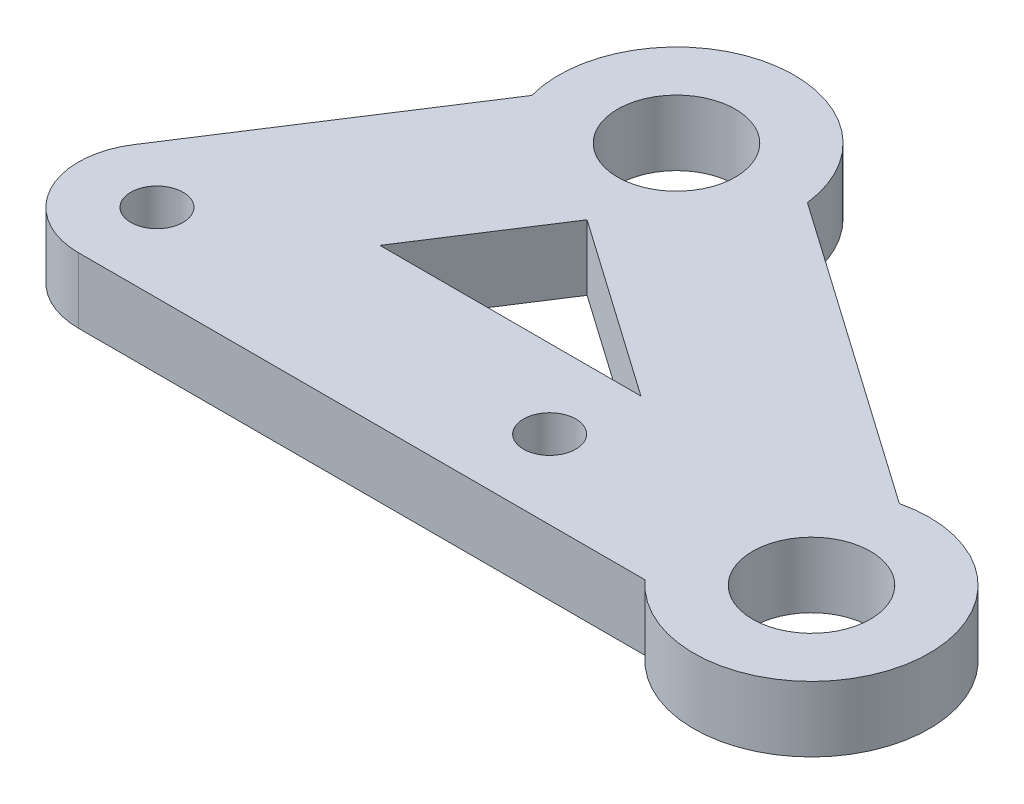
ISO-10303-21;
HEADER;
FILE_DESCRIPTION(('STEP AP214'),'2;1');
FILE_NAME('part.step','',(''),(''),'','','');
FILE_SCHEMA(('AUTOMOTIVE_DESIGN { 1 0 10303 214 1 1 1 1 }'));
ENDSEC;
DATA;
#1=APPLICATION_CONTEXT('core data for automotive mechanical design processes');
#2=APPLICATION_PROTOCOL_DEFINITION('international standard','automotive_design',2000,#1);
#3=PRODUCT_CONTEXT('',#1,'mechanical');
#4=PRODUCT('Part','Part','',(#3));
#5=PRODUCT_RELATED_PRODUCT_CATEGORY('part','',(#4));
#6=PRODUCT_DEFINITION_FORMATION('','',#4);
#7=PRODUCT_DEFINITION_CONTEXT('part definition',#1,'design');
#8=PRODUCT_DEFINITION('design','',#6,#7);
#9=PRODUCT_DEFINITION_SHAPE('','',#8);
#10=(LENGTH_UNIT() NAMED_UNIT(*) SI_UNIT(.MILLI.,.METRE.));
#11=(NAMED_UNIT(*) PLANE_ANGLE_UNIT() SI_UNIT($,.RADIAN.));
#12=(NAMED_UNIT(*) SI_UNIT($,.STERADIAN.) SOLID_ANGLE_UNIT());
#13=UNCERTAINTY_MEASURE_WITH_UNIT(LENGTH_MEASURE(1.E-05),#10,'distance_accuracy_value','');
#14=(GEOMETRIC_REPRESENTATION_CONTEXT(3) GLOBAL_UNCERTAINTY_ASSIGNED_CONTEXT((#13)) GLOBAL_UNIT_ASSIGNED_CONTEXT((#10,
#11,#12)) REPRESENTATION_CONTEXT('',''));
#15=CARTESIAN_POINT('',(0.,0.,0.));
#16=DIRECTION('',(0.,0.,1.));
#17=DIRECTION('',(1.,0.,0.));
#18=AXIS2_PLACEMENT_3D('',#15,#16,#17);
#19=CARTESIAN_POINT('',(6.56501201808794,5.,-9.37580882787044));
#20=DIRECTION('',(0.573576436351041,0.,-0.819152044288995));
#21=DIRECTION('',(-0.819152044288995,0.,-0.573576436351041));
#22=AXIS2_PLACEMENT_3D('',#19,#20,#21);
#23=PLANE('',#22);
#24=DIRECTION('',(0.819152044288995,0.,0.573576436351041));
#25=VECTOR('',#24,1.);
#26=CARTESIAN_POINT('',(6.56501201808794,0.,-9.37580882787044));
#27=LINE('',#26,#25);
#28=CARTESIAN_POINT('',(-4.06749566782029,0.,-16.820770859616));
#29=VERTEX_POINT('',#28);
#30=CARTESIAN_POINT('',(19.3479897976496,0.,-0.425071425854281));
#31=VERTEX_POINT('',#30);
#32=EDGE_CURVE('E164',#29,#31,#27,.T.);
#33=ORIENTED_EDGE('',*,*,#32,.F.);
#34=DIRECTION('',(0.,-1.,0.));
#35=VECTOR('',#34,1.);
#36=CARTESIAN_POINT('',(-4.06749566782029,5.,-16.820770859616));
#37=LINE('',#36,#35);
#38=CARTESIAN_POINT('',(-4.06749566782029,5.,-16.820770859616));
#39=VERTEX_POINT('',#38);
#40=EDGE_CURVE('E11',#39,#29,#37,.T.);
#41=ORIENTED_EDGE('',*,*,#40,.F.);
#42=DIRECTION('',(0.819152044288995,0.,0.573576436351041));
#43=VECTOR('',#42,1.);
#44=CARTESIAN_POINT('',(6.56501201808794,5.,-9.37580882787044));
#45=LINE('',#44,#43);
#46=CARTESIAN_POINT('',(19.3479897976496,5.,-0.425071425854281));
#47=VERTEX_POINT('',#46);
#48=EDGE_CURVE('E216',#39,#47,#45,.T.);
#49=ORIENTED_EDGE('',*,*,#48,.T.);
#50=DIRECTION('',(0.,-1.,0.));
#51=VECTOR('',#50,1.);
#52=CARTESIAN_POINT('',(19.3479897976496,5.,-0.425071425854281));
#53=LINE('',#52,#51);
#54=EDGE_CURVE('E92',#47,#31,#53,.T.);
#55=ORIENTED_EDGE('',*,*,#54,.T.);
#56=EDGE_LOOP('',(#33,#41,#49,#55));
#57=FACE_BOUND('',#56,.T.);
#58=ADVANCED_FACE('F36',(#57),#23,.T.);
#59=CARTESIAN_POINT('',(-13.0039932507409,5.,-15.753526299801));
#60=DIRECTION('',(0.,-1.,0.));
#61=DIRECTION('',(0.,0.,-1.));
#62=AXIS2_PLACEMENT_3D('',#59,#60,#61);
#63=CYLINDRICAL_SURFACE('',#62,9.);
#64=CARTESIAN_POINT('',(-13.0039932507409,0.,-15.753526299801));
#65=DIRECTION('',(0.,1.,0.));
#66=DIRECTION('',(0.,0.,1.));
#67=AXIS2_PLACEMENT_3D('',#64,#65,#66);
#68=CIRCLE('',#67,9.);
#69=CARTESIAN_POINT('',(-21.6862653263089,0.,-13.3832622626498));
#70=VERTEX_POINT('',#69);
#71=EDGE_CURVE('E167',#29,#70,#68,.T.);
#72=ORIENTED_EDGE('',*,*,#71,.T.);
#73=DIRECTION('',(0.,-1.,0.));
#74=VECTOR('',#73,1.);
#75=CARTESIAN_POINT('',(-21.6862653263089,5.,-13.3832622626498));
#76=LINE('',#75,#74);
#77=CARTESIAN_POINT('',(-21.6862653263089,5.,-13.3832622626498));
#78=VERTEX_POINT('',#77);
#79=EDGE_CURVE('E46',#78,#70,#76,.T.);
#80=ORIENTED_EDGE('',*,*,#79,.F.);
#81=CARTESIAN_POINT('',(-13.0039932507409,5.,-15.753526299801));
#82=DIRECTION('',(0.,1.,0.));
#83=DIRECTION('',(0.,0.,1.));
#84=AXIS2_PLACEMENT_3D('',#81,#82,#83);
#85=CIRCLE('',#84,9.);
#86=EDGE_CURVE('E218',#39,#78,#85,.T.);
#87=ORIENTED_EDGE('',*,*,#86,.F.);
#88=ORIENTED_EDGE('',*,*,#40,.T.);
#89=EDGE_LOOP('',(#72,#80,#87,#88));
#90=FACE_BOUND('',#89,.T.);
#91=ADVANCED_FACE('F222',(#90),#63,.T.);
#92=CARTESIAN_POINT('',(-21.3865616185852,5.,-13.8461792659221));
#93=DIRECTION('',(0.839430209734411,0.,0.543467499474663));
#94=DIRECTION('',(0.543467499474663,0.,-0.839430209734411));
#95=AXIS2_PLACEMENT_3D('',#92,#93,#94);
#96=PLANE('',#95);
#97=DIRECTION('',(-0.543467499474663,0.,0.839430209734411));
#98=VECTOR('',#97,1.);
#99=CARTESIAN_POINT('',(-21.3865616185852,0.,-13.8461792659221));
#100=LINE('',#99,#98);
#101=CARTESIAN_POINT('',(-33.6376954079025,0.,5.07670354895066));
#102=VERTEX_POINT('',#101);
#103=EDGE_CURVE('E170',#70,#102,#100,.T.);
#104=ORIENTED_EDGE('',*,*,#103,.T.);
#105=DIRECTION('',(0.,-1.,0.));
#106=VECTOR('',#105,1.);
#107=CARTESIAN_POINT('',(-33.6376954079025,5.,5.07670354895066));
#108=LINE('',#107,#106);
#109=CARTESIAN_POINT('',(-33.6376954079025,5.,5.07670354895066));
#110=VERTEX_POINT('',#109);
#111=EDGE_CURVE('E129',#110,#102,#108,.T.);
#112=ORIENTED_EDGE('',*,*,#111,.F.);
#113=DIRECTION('',(-0.543467499474663,0.,0.839430209734411));
#114=VECTOR('',#113,1.);
#115=CARTESIAN_POINT('',(-21.3865616185852,5.,-13.8461792659221));
#116=LINE('',#115,#114);
#117=EDGE_CURVE('E134',#78,#110,#116,.T.);
#118=ORIENTED_EDGE('',*,*,#117,.F.);
#119=ORIENTED_EDGE('',*,*,#79,.T.);
#120=EDGE_LOOP('',(#104,#112,#118,#119));
#121=FACE_BOUND('',#120,.T.);
#122=ADVANCED_FACE('F225',(#121),#96,.F.);
#123=CARTESIAN_POINT('',(-28.6011141494961,5.,8.33750854579872));
#124=DIRECTION('',(0.,-1.,0.));
#125=DIRECTION('',(0.,0.,-1.));
#126=AXIS2_PLACEMENT_3D('',#123,#124,#125);
#127=CYLINDRICAL_SURFACE('',#126,6.);
#128=CARTESIAN_POINT('',(-28.6011141494961,0.,8.33750854579872));
#129=DIRECTION('',(0.,1.,0.));
#130=DIRECTION('',(0.,0.,1.));
#131=AXIS2_PLACEMENT_3D('',#128,#129,#130);
#132=CIRCLE('',#131,6.);
#133=CARTESIAN_POINT('',(-28.601114149496,0.,14.3375085457987));
#134=VERTEX_POINT('',#133);
#135=EDGE_CURVE('E124',#134,#102,#132,.F.);
#136=ORIENTED_EDGE('',*,*,#135,.F.);
#137=DIRECTION('',(0.,-1.,0.));
#138=VECTOR('',#137,1.);
#139=CARTESIAN_POINT('',(-28.601114149496,5.,14.3375085457987));
#140=LINE('',#139,#138);
#141=CARTESIAN_POINT('',(-28.601114149496,5.,14.3375085457987));
#142=VERTEX_POINT('',#141);
#143=EDGE_CURVE('E119',#142,#134,#140,.T.);
#144=ORIENTED_EDGE('',*,*,#143,.F.);
#145=CARTESIAN_POINT('',(-28.6011141494961,5.,8.33750854579872));
#146=DIRECTION('',(0.,1.,0.));
#147=DIRECTION('',(0.,0.,1.));
#148=AXIS2_PLACEMENT_3D('',#145,#146,#147);
#149=CIRCLE('',#148,6.);
#150=EDGE_CURVE('E122',#142,#110,#149,.F.);
#151=ORIENTED_EDGE('',*,*,#150,.T.);
#152=ORIENTED_EDGE('',*,*,#111,.T.);
#153=EDGE_LOOP('',(#136,#144,#151,#152));
#154=FACE_BOUND('',#153,.T.);
#155=ADVANCED_FACE('F121',(#154),#127,.T.);
#156=CARTESIAN_POINT('',(0.,5.,14.3375085457987));
#157=DIRECTION('',(0.,0.,1.));
#158=DIRECTION('',(1.,0.,0.));
#159=AXIS2_PLACEMENT_3D('',#156,#157,#158);
#160=PLANE('',#159);
#161=DIRECTION('',(-1.,0.,0.));
#162=VECTOR('',#161,1.);
#163=CARTESIAN_POINT('',(0.,0.,14.3375085457987));
#164=LINE('',#163,#162);
#165=CARTESIAN_POINT('',(14.6933662118583,0.,14.3375085457987));
#166=VERTEX_POINT('',#165);
#167=EDGE_CURVE('E174',#166,#134,#164,.T.);
#168=ORIENTED_EDGE('',*,*,#167,.F.);
#169=DIRECTION('',(0.,-1.,0.));
#170=VECTOR('',#169,1.);
#171=CARTESIAN_POINT('',(14.6933662118583,5.,14.3375085457987));
#172=LINE('',#171,#170);
#173=CARTESIAN_POINT('',(14.6933662118583,5.,14.3375085457987));
#174=VERTEX_POINT('',#173);
#175=EDGE_CURVE('E85',#174,#166,#172,.T.);
#176=ORIENTED_EDGE('',*,*,#175,.F.);
#177=DIRECTION('',(-1.,0.,0.));
#178=VECTOR('',#177,1.);
#179=CARTESIAN_POINT('',(0.,5.,14.3375085457987));
#180=LINE('',#179,#178);
#181=EDGE_CURVE('E132',#174,#142,#180,.T.);
#182=ORIENTED_EDGE('',*,*,#181,.T.);
#183=ORIENTED_EDGE('',*,*,#143,.T.);
#184=EDGE_LOOP('',(#168,#176,#182,#183));
#185=FACE_BOUND('',#184,.T.);
#186=ADVANCED_FACE('F137',(#185),#160,.T.);
#187=CARTESIAN_POINT('',(-0.317905218124559,5.,0.454015703597512));
#188=DIRECTION('',(0.573576436351041,0.,-0.819152044288995));
#189=DIRECTION('',(-0.819152044288995,0.,-0.573576436351041));
#190=AXIS2_PLACEMENT_3D('',#187,#188,#189);
#191=PLANE('',#190);
#192=DIRECTION('',(0.819152044288995,0.,0.573576436351041));
#193=VECTOR('',#192,1.);
#194=CARTESIAN_POINT('',(-0.317905218124559,0.,0.454015703597512));
#195=LINE('',#194,#193);
#196=CARTESIAN_POINT('',(-11.3487954116625,0.,-7.26989676308122));
#197=VERTEX_POINT('',#196);
#198=CARTESIAN_POINT('',(2.37200133017817,0.,2.33750854579872));
#199=VERTEX_POINT('',#198);
#200=EDGE_CURVE('E146',#197,#199,#195,.T.);
#201=ORIENTED_EDGE('',*,*,#200,.T.);
#202=DIRECTION('',(0.,-1.,0.));
#203=VECTOR('',#202,1.);
#204=CARTESIAN_POINT('',(2.37200133017817,5.,2.33750854579872));
#205=LINE('',#204,#203);
#206=CARTESIAN_POINT('',(2.37200133017817,5.,2.33750854579872));
#207=VERTEX_POINT('',#206);
#208=EDGE_CURVE('E40',#207,#199,#205,.T.);
#209=ORIENTED_EDGE('',*,*,#208,.F.);
#210=DIRECTION('',(0.819152044288995,0.,0.573576436351041));
#211=VECTOR('',#210,1.);
#212=CARTESIAN_POINT('',(-0.317905218124559,5.,0.454015703597512));
#213=LINE('',#212,#211);
#214=CARTESIAN_POINT('',(-11.3487954116625,5.,-7.26989676308122));
#215=VERTEX_POINT('',#214);
#216=EDGE_CURVE('E200',#215,#207,#213,.T.);
#217=ORIENTED_EDGE('',*,*,#216,.F.);
#218=DIRECTION('',(0.,-1.,0.));
#219=VECTOR('',#218,1.);
#220=CARTESIAN_POINT('',(-11.3487954116625,5.,-7.26989676308122));
#221=LINE('',#220,#219);
#222=EDGE_CURVE('E139',#215,#197,#221,.T.);
#223=ORIENTED_EDGE('',*,*,#222,.T.);
#224=EDGE_LOOP('',(#201,#209,#217,#223));
#225=FACE_BOUND('',#224,.T.);
#226=ADVANCED_FACE('F193',(#225),#191,.F.);
#227=CARTESIAN_POINT('',(0.,5.,2.33750854579872));
#228=DIRECTION('',(0.,0.,1.));
#229=DIRECTION('',(1.,0.,0.));
#230=AXIS2_PLACEMENT_3D('',#227,#228,#229);
#231=PLANE('',#230);
#232=DIRECTION('',(-1.,0.,0.));
#233=VECTOR('',#232,1.);
#234=CARTESIAN_POINT('',(0.,0.,2.33750854579872));
#235=LINE('',#234,#233);
#236=CARTESIAN_POINT('',(-17.5688628801761,0.,2.33750854579872));
#237=VERTEX_POINT('',#236);
#238=EDGE_CURVE('E149',#199,#237,#235,.T.);
#239=ORIENTED_EDGE('',*,*,#238,.T.);
#240=DIRECTION('',(0.,-1.,0.));
#241=VECTOR('',#240,1.);
#242=CARTESIAN_POINT('',(-17.5688628801761,5.,2.33750854579872));
#243=LINE('',#242,#241);
#244=CARTESIAN_POINT('',(-17.5688628801761,5.,2.33750854579872));
#245=VERTEX_POINT('',#244);
#246=EDGE_CURVE('E184',#245,#237,#243,.T.);
#247=ORIENTED_EDGE('',*,*,#246,.F.);
#248=DIRECTION('',(-1.,0.,0.));
#249=VECTOR('',#248,1.);
#250=CARTESIAN_POINT('',(0.,5.,2.33750854579872));
#251=LINE('',#250,#249);
#252=EDGE_CURVE('E100',#207,#245,#251,.T.);
#253=ORIENTED_EDGE('',*,*,#252,.F.);
#254=ORIENTED_EDGE('',*,*,#208,.T.);
#255=EDGE_LOOP('',(#239,#247,#253,#254));
#256=FACE_BOUND('',#255,.T.);
#257=ADVANCED_FACE('F189',(#256),#231,.F.);
#258=CARTESIAN_POINT('',(-13.0039932507409,5.,-15.753526299801));
#259=DIRECTION('',(0.,-1.,0.));
#260=DIRECTION('',(0.,0.,-1.));
#261=AXIS2_PLACEMENT_3D('',#258,#259,#260);
#262=CYLINDRICAL_SURFACE('',#261,4.5);
#263=CARTESIAN_POINT('',(-13.0039932507409,5.,-15.753526299801));
#264=DIRECTION('',(0.,1.,0.));
#265=DIRECTION('',(0.,0.,1.));
#266=AXIS2_PLACEMENT_3D('',#263,#264,#265);
#267=CIRCLE('',#266,4.5);
#268=CARTESIAN_POINT('',(-13.0039932507409,5.,-11.253526299801));
#269=VERTEX_POINT('',#268);
#270=EDGE_CURVE('E213',#269,#269,#267,.T.);
#271=ORIENTED_EDGE('',*,*,#270,.T.);
#272=EDGE_LOOP('',(#271));
#273=FACE_BOUND('',#272,.T.);
#274=CARTESIAN_POINT('',(-13.0039932507409,0.,-15.753526299801));
#275=DIRECTION('',(0.,1.,0.));
#276=DIRECTION('',(0.,0.,1.));
#277=AXIS2_PLACEMENT_3D('',#274,#275,#276);
#278=CIRCLE('',#277,4.5);
#279=CARTESIAN_POINT('',(-13.0039932507409,0.,-11.253526299801));
#280=VERTEX_POINT('',#279);
#281=EDGE_CURVE('E161',#280,#280,#278,.T.);
#282=ORIENTED_EDGE('',*,*,#281,.F.);
#283=EDGE_LOOP('',(#282));
#284=FACE_BOUND('',#283,.T.);
#285=ADVANCED_FACE('F236',(#273,#284),#262,.F.);
#286=CARTESIAN_POINT('',(-28.6011141494961,5.,8.33750854579872));
#287=DIRECTION('',(0.,-1.,0.));
#288=DIRECTION('',(0.,0.,-1.));
#289=AXIS2_PLACEMENT_3D('',#286,#287,#288);
#290=CYLINDRICAL_SURFACE('',#289,2.);
#291=CARTESIAN_POINT('',(-28.6011141494961,5.,8.33750854579872));
#292=DIRECTION('',(0.,1.,0.));
#293=DIRECTION('',(0.,0.,1.));
#294=AXIS2_PLACEMENT_3D('',#291,#292,#293);
#295=CIRCLE('',#294,2.);
#296=CARTESIAN_POINT('',(-28.6011141494961,5.,10.3375085457987));
#297=VERTEX_POINT('',#296);
#298=EDGE_CURVE('E207',#297,#297,#295,.T.);
#299=ORIENTED_EDGE('',*,*,#298,.T.);
#300=EDGE_LOOP('',(#299));
#301=FACE_BOUND('',#300,.T.);
#302=CARTESIAN_POINT('',(-28.6011141494961,0.,8.33750854579872));
#303=DIRECTION('',(0.,1.,0.));
#304=DIRECTION('',(0.,0.,1.));
#305=AXIS2_PLACEMENT_3D('',#302,#303,#304);
#306=CIRCLE('',#305,2.);
#307=CARTESIAN_POINT('',(-28.6011141494961,0.,10.3375085457987));
#308=VERTEX_POINT('',#307);
#309=EDGE_CURVE('E158',#308,#308,#306,.T.);
#310=ORIENTED_EDGE('',*,*,#309,.F.);
#311=EDGE_LOOP('',(#310));
#312=FACE_BOUND('',#311,.T.);
#313=ADVANCED_FACE('F239',(#301,#312),#290,.F.);
#314=CARTESIAN_POINT('',(21.4015701443576,5.,8.33750854579872));
#315=DIRECTION('',(0.,-1.,0.));
#316=DIRECTION('',(0.,0.,-1.));
#317=AXIS2_PLACEMENT_3D('',#314,#315,#316);
#318=CYLINDRICAL_SURFACE('',#317,4.5);
#319=CARTESIAN_POINT('',(21.4015701443576,5.,8.33750854579872));
#320=DIRECTION('',(0.,1.,0.));
#321=DIRECTION('',(0.,0.,1.));
#322=AXIS2_PLACEMENT_3D('',#319,#320,#321);
#323=CIRCLE('',#322,4.5);
#324=CARTESIAN_POINT('',(21.4015701443576,5.,12.8375085457987));
#325=VERTEX_POINT('',#324);
#326=EDGE_CURVE('E204',#325,#325,#323,.T.);
#327=ORIENTED_EDGE('',*,*,#326,.T.);
#328=EDGE_LOOP('',(#327));
#329=FACE_BOUND('',#328,.T.);
#330=CARTESIAN_POINT('',(21.4015701443576,0.,8.33750854579872));
#331=DIRECTION('',(0.,1.,0.));
#332=DIRECTION('',(0.,0.,1.));
#333=AXIS2_PLACEMENT_3D('',#330,#331,#332);
#334=CIRCLE('',#333,4.5);
#335=CARTESIAN_POINT('',(21.4015701443576,0.,12.8375085457987));
#336=VERTEX_POINT('',#335);
#337=EDGE_CURVE('E155',#336,#336,#334,.T.);
#338=ORIENTED_EDGE('',*,*,#337,.F.);
#339=EDGE_LOOP('',(#338));
#340=FACE_BOUND('',#339,.T.);
#341=ADVANCED_FACE('F243',(#329,#340),#318,.F.);
#342=CARTESIAN_POINT('',(-11.3133991017722,5.,-7.32456927222618));
#343=DIRECTION('',(0.839430209734411,0.,0.543467499474663));
#344=DIRECTION('',(0.543467499474663,0.,-0.839430209734411));
#345=AXIS2_PLACEMENT_3D('',#342,#343,#344);
#346=PLANE('',#345);
#347=DIRECTION('',(-0.543467499474663,0.,0.839430209734411));
#348=VECTOR('',#347,1.);
#349=CARTESIAN_POINT('',(-11.3133991017722,0.,-7.32456927222618));
#350=LINE('',#349,#348);
#351=EDGE_CURVE('E152',#197,#237,#350,.T.);
#352=ORIENTED_EDGE('',*,*,#351,.F.);
#353=ORIENTED_EDGE('',*,*,#222,.F.);
#354=DIRECTION('',(-0.543467499474663,0.,0.839430209734411));
#355=VECTOR('',#354,1.);
#356=CARTESIAN_POINT('',(-11.3133991017722,5.,-7.32456927222618));
#357=LINE('',#356,#355);
#358=EDGE_CURVE('E199',#215,#245,#357,.T.);
#359=ORIENTED_EDGE('',*,*,#358,.T.);
#360=ORIENTED_EDGE('',*,*,#246,.T.);
#361=EDGE_LOOP('',(#352,#353,#359,#360));
#362=FACE_BOUND('',#361,.T.);
#363=ADVANCED_FACE('F197',(#362),#346,.T.);
#364=CARTESIAN_POINT('',(1.39888585050392,5.,8.33750854579872));
#365=DIRECTION('',(0.,-1.,0.));
#366=DIRECTION('',(0.,0.,-1.));
#367=AXIS2_PLACEMENT_3D('',#364,#365,#366);
#368=CYLINDRICAL_SURFACE('',#367,2.);
#369=CARTESIAN_POINT('',(1.39888585050392,5.,8.33750854579872));
#370=DIRECTION('',(0.,1.,0.));
#371=DIRECTION('',(0.,0.,1.));
#372=AXIS2_PLACEMENT_3D('',#369,#370,#371);
#373=CIRCLE('',#372,2.);
#374=CARTESIAN_POINT('',(1.39888585050392,5.,10.3375085457987));
#375=VERTEX_POINT('',#374);
#376=EDGE_CURVE('E178',#375,#375,#373,.T.);
#377=ORIENTED_EDGE('',*,*,#376,.T.);
#378=EDGE_LOOP('',(#377));
#379=FACE_BOUND('',#378,.T.);
#380=CARTESIAN_POINT('',(1.39888585050392,0.,8.33750854579872));
#381=DIRECTION('',(0.,1.,0.));
#382=DIRECTION('',(0.,0.,1.));
#383=AXIS2_PLACEMENT_3D('',#380,#381,#382);
#384=CIRCLE('',#383,2.);
#385=CARTESIAN_POINT('',(1.39888585050392,0.,10.3375085457987));
#386=VERTEX_POINT('',#385);
#387=EDGE_CURVE('E143',#386,#386,#384,.T.);
#388=ORIENTED_EDGE('',*,*,#387,.F.);
#389=EDGE_LOOP('',(#388));
#390=FACE_BOUND('',#389,.T.);
#391=ADVANCED_FACE('F38',(#379,#390),#368,.F.);
#392=CARTESIAN_POINT('',(21.4015701443576,5.,8.33750854579872));
#393=DIRECTION('',(0.,-1.,0.));
#394=DIRECTION('',(0.,0.,-1.));
#395=AXIS2_PLACEMENT_3D('',#392,#393,#394);
#396=CYLINDRICAL_SURFACE('',#395,9.);
#397=CARTESIAN_POINT('',(21.4015701443576,0.,8.33750854579872));
#398=DIRECTION('',(0.,1.,0.));
#399=DIRECTION('',(0.,0.,1.));
#400=AXIS2_PLACEMENT_3D('',#397,#398,#399);
#401=CIRCLE('',#400,9.);
#402=EDGE_CURVE('E176',#166,#31,#401,.T.);
#403=ORIENTED_EDGE('',*,*,#402,.T.);
#404=ORIENTED_EDGE('',*,*,#54,.F.);
#405=CARTESIAN_POINT('',(21.4015701443576,5.,8.33750854579872));
#406=DIRECTION('',(0.,1.,0.));
#407=DIRECTION('',(0.,0.,1.));
#408=AXIS2_PLACEMENT_3D('',#405,#406,#407);
#409=CIRCLE('',#408,9.);
#410=EDGE_CURVE('E55',#174,#47,#409,.T.);
#411=ORIENTED_EDGE('',*,*,#410,.F.);
#412=ORIENTED_EDGE('',*,*,#175,.T.);
#413=EDGE_LOOP('',(#403,#404,#411,#412));
#414=FACE_BOUND('',#413,.T.);
#415=ADVANCED_FACE('F227',(#414),#396,.T.);
#416=CARTESIAN_POINT('',(0.,5.,0.));
#417=DIRECTION('',(0.,1.,0.));
#418=DIRECTION('',(0.,0.,1.));
#419=AXIS2_PLACEMENT_3D('',#416,#417,#418);
#420=PLANE('',#419);
#421=ORIENTED_EDGE('',*,*,#376,.F.);
#422=EDGE_LOOP('',(#421));
#423=FACE_BOUND('',#422,.T.);
#424=ORIENTED_EDGE('',*,*,#216,.T.);
#425=ORIENTED_EDGE('',*,*,#252,.T.);
#426=ORIENTED_EDGE('',*,*,#358,.F.);
#427=EDGE_LOOP('',(#424,#425,#426));
#428=FACE_BOUND('',#427,.T.);
#429=ORIENTED_EDGE('',*,*,#326,.F.);
#430=EDGE_LOOP('',(#429));
#431=FACE_BOUND('',#430,.T.);
#432=ORIENTED_EDGE('',*,*,#298,.F.);
#433=EDGE_LOOP('',(#432));
#434=FACE_BOUND('',#433,.T.);
#435=ORIENTED_EDGE('',*,*,#270,.F.);
#436=EDGE_LOOP('',(#435));
#437=FACE_BOUND('',#436,.T.);
#438=ORIENTED_EDGE('',*,*,#48,.F.);
#439=ORIENTED_EDGE('',*,*,#86,.T.);
#440=ORIENTED_EDGE('',*,*,#117,.T.);
#441=ORIENTED_EDGE('',*,*,#150,.F.);
#442=ORIENTED_EDGE('',*,*,#181,.F.);
#443=ORIENTED_EDGE('',*,*,#410,.T.);
#444=EDGE_LOOP('',(#438,#439,#440,#441,#442,#443));
#445=FACE_BOUND('',#444,.T.);
#446=ADVANCED_FACE('F131',(#423,#428,#431,#434,#437,#445),#420,.T.);
#447=CARTESIAN_POINT('',(0.,0.,0.));
#448=DIRECTION('',(0.,1.,0.));
#449=DIRECTION('',(0.,0.,1.));
#450=AXIS2_PLACEMENT_3D('',#447,#448,#449);
#451=PLANE('',#450);
#452=ORIENTED_EDGE('',*,*,#387,.T.);
#453=EDGE_LOOP('',(#452));
#454=FACE_BOUND('',#453,.T.);
#455=ORIENTED_EDGE('',*,*,#200,.F.);
#456=ORIENTED_EDGE('',*,*,#351,.T.);
#457=ORIENTED_EDGE('',*,*,#238,.F.);
#458=EDGE_LOOP('',(#455,#456,#457));
#459=FACE_BOUND('',#458,.T.);
#460=ORIENTED_EDGE('',*,*,#337,.T.);
#461=EDGE_LOOP('',(#460));
#462=FACE_BOUND('',#461,.T.);
#463=ORIENTED_EDGE('',*,*,#309,.T.);
#464=EDGE_LOOP('',(#463));
#465=FACE_BOUND('',#464,.T.);
#466=ORIENTED_EDGE('',*,*,#281,.T.);
#467=EDGE_LOOP('',(#466));
#468=FACE_BOUND('',#467,.T.);
#469=ORIENTED_EDGE('',*,*,#32,.T.);
#470=ORIENTED_EDGE('',*,*,#402,.F.);
#471=ORIENTED_EDGE('',*,*,#167,.T.);
#472=ORIENTED_EDGE('',*,*,#135,.T.);
#473=ORIENTED_EDGE('',*,*,#103,.F.);
#474=ORIENTED_EDGE('',*,*,#71,.F.);
#475=EDGE_LOOP('',(#469,#470,#471,#472,#473,#474));
#476=FACE_BOUND('',#475,.T.);
#477=ADVANCED_FACE('F195',(#454,#459,#462,#465,#468,#476),#451,.F.);
#478=CLOSED_SHELL('',(#58,#91,#122,#155,#186,#226,#257,#285,#313,#341,#363,#391,#415,#446,#477));
#479=MANIFOLD_SOLID_BREP('B2',#478);
#480=ADVANCED_BREP_SHAPE_REPRESENTATION('',(#18,#479),#14);
#481=SHAPE_DEFINITION_REPRESENTATION(#9,#480);
ENDSEC;
END-ISO-10303-21;
